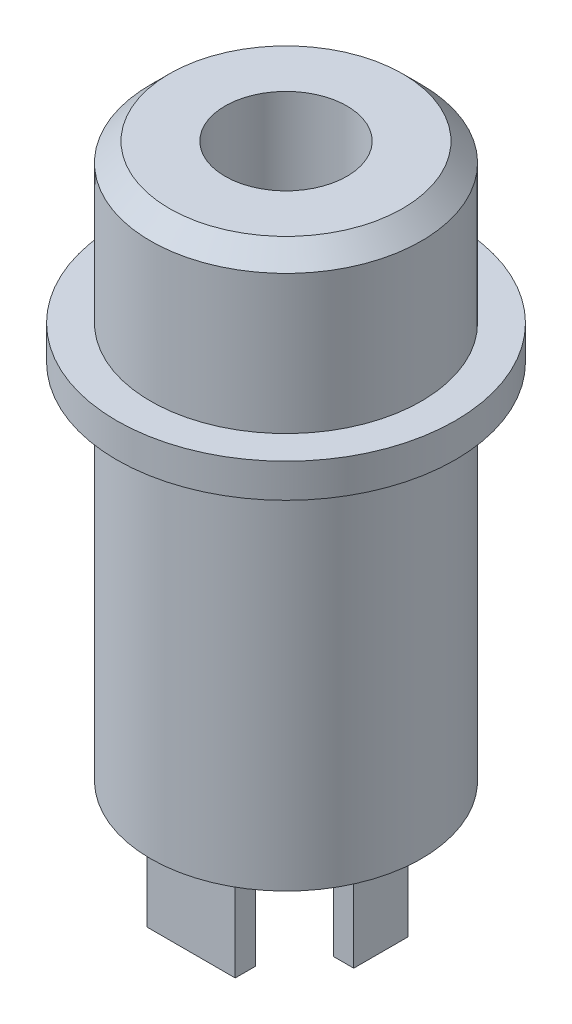
ISO-10303-21;
HEADER;
FILE_DESCRIPTION(('STEP AP214'),'2;1');
FILE_NAME('part.step','',(''),(''),'','','');
FILE_SCHEMA(('AUTOMOTIVE_DESIGN { 1 0 10303 214 1 1 1 1 }'));
ENDSEC;
DATA;
#1=APPLICATION_CONTEXT('core data for automotive mechanical design processes');
#2=APPLICATION_PROTOCOL_DEFINITION('international standard','automotive_design',2000,#1);
#3=PRODUCT_CONTEXT('',#1,'mechanical');
#4=PRODUCT('Part','Part','',(#3));
#5=PRODUCT_RELATED_PRODUCT_CATEGORY('part','',(#4));
#6=PRODUCT_DEFINITION_FORMATION('','',#4);
#7=PRODUCT_DEFINITION_CONTEXT('part definition',#1,'design');
#8=PRODUCT_DEFINITION('design','',#6,#7);
#9=PRODUCT_DEFINITION_SHAPE('','',#8);
#10=(LENGTH_UNIT() NAMED_UNIT(*) SI_UNIT(.MILLI.,.METRE.));
#11=(NAMED_UNIT(*) PLANE_ANGLE_UNIT() SI_UNIT($,.RADIAN.));
#12=(NAMED_UNIT(*) SI_UNIT($,.STERADIAN.) SOLID_ANGLE_UNIT());
#13=UNCERTAINTY_MEASURE_WITH_UNIT(LENGTH_MEASURE(1.E-05),#10,'distance_accuracy_value','');
#14=(GEOMETRIC_REPRESENTATION_CONTEXT(3) GLOBAL_UNCERTAINTY_ASSIGNED_CONTEXT((#13)) GLOBAL_UNIT_ASSIGNED_CONTEXT((#10,
#11,#12)) REPRESENTATION_CONTEXT('',''));
#15=CARTESIAN_POINT('',(0.,0.,0.));
#16=DIRECTION('',(0.,0.,1.));
#17=DIRECTION('',(1.,0.,0.));
#18=AXIS2_PLACEMENT_3D('',#15,#16,#17);
#19=CARTESIAN_POINT('',(0.,-11.7,0.));
#20=DIRECTION('',(0.,1.,0.));
#21=DIRECTION('',(0.,0.,1.));
#22=AXIS2_PLACEMENT_3D('',#19,#20,#21);
#23=PLANE('',#22);
#24=DIRECTION('',(1.,0.,0.));
#25=VECTOR('',#24,1.);
#26=CARTESIAN_POINT('',(0.,-11.7,-0.8));
#27=LINE('',#26,#25);
#28=CARTESIAN_POINT('',(-2.8,-11.7,-0.800000000000001));
#29=VERTEX_POINT('',#28);
#30=CARTESIAN_POINT('',(-2.2,-11.7,-0.8));
#31=VERTEX_POINT('',#30);
#32=EDGE_CURVE('E207',#29,#31,#27,.T.);
#33=ORIENTED_EDGE('',*,*,#32,.F.);
#34=DIRECTION('',(0.,0.,-1.));
#35=VECTOR('',#34,1.);
#36=CARTESIAN_POINT('',(-2.8,-11.7,0.));
#37=LINE('',#36,#35);
#38=CARTESIAN_POINT('',(-2.8,-11.7,0.799999999999999));
#39=VERTEX_POINT('',#38);
#40=EDGE_CURVE('E221',#39,#29,#37,.T.);
#41=ORIENTED_EDGE('',*,*,#40,.F.);
#42=DIRECTION('',(1.,0.,0.));
#43=VECTOR('',#42,1.);
#44=CARTESIAN_POINT('',(0.,-11.7,0.799999999999999));
#45=LINE('',#44,#43);
#46=CARTESIAN_POINT('',(-2.2,-11.7,0.799999999999999));
#47=VERTEX_POINT('',#46);
#48=EDGE_CURVE('E235',#39,#47,#45,.T.);
#49=ORIENTED_EDGE('',*,*,#48,.T.);
#50=DIRECTION('',(0.,0.,-1.));
#51=VECTOR('',#50,1.);
#52=CARTESIAN_POINT('',(-2.2,-11.7,0.));
#53=LINE('',#52,#51);
#54=EDGE_CURVE('E89',#47,#31,#53,.T.);
#55=ORIENTED_EDGE('',*,*,#54,.T.);
#56=EDGE_LOOP('',(#33,#41,#49,#55));
#57=FACE_BOUND('',#56,.T.);
#58=DIRECTION('',(1.,0.,0.));
#59=VECTOR('',#58,1.);
#60=CARTESIAN_POINT('',(0.,-11.7,-2.8));
#61=LINE('',#60,#59);
#62=CARTESIAN_POINT('',(-0.8,-11.7,-2.8));
#63=VERTEX_POINT('',#62);
#64=CARTESIAN_POINT('',(0.8,-11.7,-2.8));
#65=VERTEX_POINT('',#64);
#66=EDGE_CURVE('E261',#63,#65,#61,.T.);
#67=ORIENTED_EDGE('',*,*,#66,.F.);
#68=DIRECTION('',(0.,0.,1.));
#69=VECTOR('',#68,1.);
#70=CARTESIAN_POINT('',(-0.799999999999999,-11.7,0.));
#71=LINE('',#70,#69);
#72=CARTESIAN_POINT('',(-0.8,-11.7,-2.2));
#73=VERTEX_POINT('',#72);
#74=EDGE_CURVE('E255',#63,#73,#71,.T.);
#75=ORIENTED_EDGE('',*,*,#74,.T.);
#76=DIRECTION('',(1.,0.,0.));
#77=VECTOR('',#76,1.);
#78=CARTESIAN_POINT('',(0.,-11.7,-2.2));
#79=LINE('',#78,#77);
#80=CARTESIAN_POINT('',(0.8,-11.7,-2.2));
#81=VERTEX_POINT('',#80);
#82=EDGE_CURVE('E275',#73,#81,#79,.T.);
#83=ORIENTED_EDGE('',*,*,#82,.T.);
#84=DIRECTION('',(0.,0.,1.));
#85=VECTOR('',#84,1.);
#86=CARTESIAN_POINT('',(0.800000000000001,-11.7,0.));
#87=LINE('',#86,#85);
#88=EDGE_CURVE('E279',#65,#81,#87,.T.);
#89=ORIENTED_EDGE('',*,*,#88,.F.);
#90=EDGE_LOOP('',(#67,#75,#83,#89));
#91=FACE_BOUND('',#90,.T.);
#92=CARTESIAN_POINT('',(0.,-11.7,0.));
#93=DIRECTION('',(0.,1.,0.));
#94=DIRECTION('',(0.,0.,1.));
#95=AXIS2_PLACEMENT_3D('',#92,#93,#94);
#96=CIRCLE('',#95,4.);
#97=CARTESIAN_POINT('',(0.,-11.7,4.));
#98=VERTEX_POINT('',#97);
#99=EDGE_CURVE('E12',#98,#98,#96,.T.);
#100=ORIENTED_EDGE('',*,*,#99,.F.);
#101=EDGE_LOOP('',(#100));
#102=FACE_BOUND('',#101,.T.);
#103=DIRECTION('',(1.,0.,0.));
#104=VECTOR('',#103,1.);
#105=CARTESIAN_POINT('',(0.,-11.7,-0.8));
#106=LINE('',#105,#104);
#107=CARTESIAN_POINT('',(2.2,-11.7,-0.8));
#108=VERTEX_POINT('',#107);
#109=CARTESIAN_POINT('',(2.8,-11.7,-0.8));
#110=VERTEX_POINT('',#109);
#111=EDGE_CURVE('E287',#108,#110,#106,.T.);
#112=ORIENTED_EDGE('',*,*,#111,.F.);
#113=DIRECTION('',(0.,0.,-1.));
#114=VECTOR('',#113,1.);
#115=CARTESIAN_POINT('',(2.2,-11.7,0.));
#116=LINE('',#115,#114);
#117=CARTESIAN_POINT('',(2.2,-11.7,0.8));
#118=VERTEX_POINT('',#117);
#119=EDGE_CURVE('E302',#118,#108,#116,.T.);
#120=ORIENTED_EDGE('',*,*,#119,.F.);
#121=DIRECTION('',(1.,0.,0.));
#122=VECTOR('',#121,1.);
#123=CARTESIAN_POINT('',(0.,-11.7,0.8));
#124=LINE('',#123,#122);
#125=CARTESIAN_POINT('',(2.8,-11.7,0.8));
#126=VERTEX_POINT('',#125);
#127=EDGE_CURVE('E320',#118,#126,#124,.T.);
#128=ORIENTED_EDGE('',*,*,#127,.T.);
#129=DIRECTION('',(0.,0.,-1.));
#130=VECTOR('',#129,1.);
#131=CARTESIAN_POINT('',(2.8,-11.7,0.));
#132=LINE('',#131,#130);
#133=EDGE_CURVE('E317',#126,#110,#132,.T.);
#134=ORIENTED_EDGE('',*,*,#133,.T.);
#135=EDGE_LOOP('',(#112,#120,#128,#134));
#136=FACE_BOUND('',#135,.T.);
#137=DIRECTION('',(0.,0.,-1.));
#138=VECTOR('',#137,1.);
#139=CARTESIAN_POINT('',(-1.3,-11.7,0.));
#140=LINE('',#139,#138);
#141=CARTESIAN_POINT('',(-1.3,-11.7,2.8));
#142=VERTEX_POINT('',#141);
#143=CARTESIAN_POINT('',(-1.3,-11.7,2.2));
#144=VERTEX_POINT('',#143);
#145=EDGE_CURVE('E204',#142,#144,#140,.T.);
#146=ORIENTED_EDGE('',*,*,#145,.F.);
#147=DIRECTION('',(1.,0.,0.));
#148=VECTOR('',#147,1.);
#149=CARTESIAN_POINT('',(0.,-11.7,2.8));
#150=LINE('',#149,#148);
#151=CARTESIAN_POINT('',(1.3,-11.7,2.8));
#152=VERTEX_POINT('',#151);
#153=EDGE_CURVE('E200',#142,#152,#150,.T.);
#154=ORIENTED_EDGE('',*,*,#153,.T.);
#155=DIRECTION('',(0.,0.,-1.));
#156=VECTOR('',#155,1.);
#157=CARTESIAN_POINT('',(1.3,-11.7,0.));
#158=LINE('',#157,#156);
#159=CARTESIAN_POINT('',(1.3,-11.7,2.2));
#160=VERTEX_POINT('',#159);
#161=EDGE_CURVE('E81',#152,#160,#158,.T.);
#162=ORIENTED_EDGE('',*,*,#161,.T.);
#163=DIRECTION('',(1.,0.,0.));
#164=VECTOR('',#163,1.);
#165=CARTESIAN_POINT('',(0.,-11.7,2.2));
#166=LINE('',#165,#164);
#167=EDGE_CURVE('E692',#144,#160,#166,.T.);
#168=ORIENTED_EDGE('',*,*,#167,.F.);
#169=EDGE_LOOP('',(#146,#154,#162,#168));
#170=FACE_BOUND('',#169,.T.);
#171=ADVANCED_FACE('F65',(#57,#91,#102,#136,#170),#23,.F.);
#172=CARTESIAN_POINT('',(0.,-11.7,0.));
#173=DIRECTION('',(0.,1.,0.));
#174=DIRECTION('',(0.,0.,1.));
#175=AXIS2_PLACEMENT_3D('',#172,#173,#174);
#176=CYLINDRICAL_SURFACE('',#175,4.);
#177=ORIENTED_EDGE('',*,*,#99,.T.);
#178=EDGE_LOOP('',(#177));
#179=FACE_BOUND('',#178,.T.);
#180=CARTESIAN_POINT('',(0.,-1.,0.));
#181=DIRECTION('',(0.,1.,0.));
#182=DIRECTION('',(0.,0.,1.));
#183=AXIS2_PLACEMENT_3D('',#180,#181,#182);
#184=CIRCLE('',#183,4.);
#185=CARTESIAN_POINT('',(0.,-1.,4.));
#186=VERTEX_POINT('',#185);
#187=EDGE_CURVE('E362',#186,#186,#184,.T.);
#188=ORIENTED_EDGE('',*,*,#187,.F.);
#189=EDGE_LOOP('',(#188));
#190=FACE_BOUND('',#189,.T.);
#191=ADVANCED_FACE('F67',(#179,#190),#176,.T.);
#192=CARTESIAN_POINT('',(0.,-1.,0.));
#193=DIRECTION('',(0.,1.,0.));
#194=DIRECTION('',(0.,0.,1.));
#195=AXIS2_PLACEMENT_3D('',#192,#193,#194);
#196=CYLINDRICAL_SURFACE('',#195,5.);
#197=CARTESIAN_POINT('',(0.,-1.,0.));
#198=DIRECTION('',(0.,1.,0.));
#199=DIRECTION('',(0.,0.,1.));
#200=AXIS2_PLACEMENT_3D('',#197,#198,#199);
#201=CIRCLE('',#200,5.);
#202=CARTESIAN_POINT('',(0.,-1.,5.));
#203=VERTEX_POINT('',#202);
#204=EDGE_CURVE('E74',#203,#203,#201,.T.);
#205=ORIENTED_EDGE('',*,*,#204,.T.);
#206=EDGE_LOOP('',(#205));
#207=FACE_BOUND('',#206,.T.);
#208=CARTESIAN_POINT('',(0.,0.,0.));
#209=DIRECTION('',(0.,1.,0.));
#210=DIRECTION('',(0.,0.,1.));
#211=AXIS2_PLACEMENT_3D('',#208,#209,#210);
#212=CIRCLE('',#211,5.);
#213=CARTESIAN_POINT('',(0.,0.,5.));
#214=VERTEX_POINT('',#213);
#215=EDGE_CURVE('E361',#214,#214,#212,.T.);
#216=ORIENTED_EDGE('',*,*,#215,.F.);
#217=EDGE_LOOP('',(#216));
#218=FACE_BOUND('',#217,.T.);
#219=ADVANCED_FACE('F374',(#207,#218),#196,.T.);
#220=CARTESIAN_POINT('',(0.,-1.,0.));
#221=DIRECTION('',(0.,1.,0.));
#222=DIRECTION('',(0.,0.,1.));
#223=AXIS2_PLACEMENT_3D('',#220,#221,#222);
#224=PLANE('',#223);
#225=ORIENTED_EDGE('',*,*,#187,.T.);
#226=EDGE_LOOP('',(#225));
#227=FACE_BOUND('',#226,.T.);
#228=ORIENTED_EDGE('',*,*,#204,.F.);
#229=EDGE_LOOP('',(#228));
#230=FACE_BOUND('',#229,.T.);
#231=ADVANCED_FACE('F376',(#227,#230),#224,.F.);
#232=CARTESIAN_POINT('',(0.,0.,0.));
#233=DIRECTION('',(0.,1.,0.));
#234=DIRECTION('',(0.,0.,1.));
#235=AXIS2_PLACEMENT_3D('',#232,#233,#234);
#236=PLANE('',#235);
#237=CARTESIAN_POINT('',(0.,0.,0.));
#238=DIRECTION('',(0.,-1.,0.));
#239=DIRECTION('',(0.,0.,-1.));
#240=AXIS2_PLACEMENT_3D('',#237,#238,#239);
#241=CIRCLE('',#240,4.);
#242=CARTESIAN_POINT('',(0.,0.,-4.));
#243=VERTEX_POINT('',#242);
#244=EDGE_CURVE('E346',#243,#243,#241,.T.);
#245=ORIENTED_EDGE('',*,*,#244,.T.);
#246=EDGE_LOOP('',(#245));
#247=FACE_BOUND('',#246,.T.);
#248=ORIENTED_EDGE('',*,*,#215,.T.);
#249=EDGE_LOOP('',(#248));
#250=FACE_BOUND('',#249,.T.);
#251=ADVANCED_FACE('F372',(#247,#250),#236,.T.);
#252=CARTESIAN_POINT('',(3.4455,4.65,0.));
#253=DIRECTION('',(0.,1.,0.));
#254=DIRECTION('',(0.,0.,1.));
#255=AXIS2_PLACEMENT_3D('',#252,#253,#254);
#256=PLANE('',#255);
#257=CARTESIAN_POINT('',(0.,4.65,0.));
#258=DIRECTION('',(0.,1.,0.));
#259=DIRECTION('',(0.,0.,1.));
#260=AXIS2_PLACEMENT_3D('',#257,#258,#259);
#261=CIRCLE('',#260,1.8);
#262=CARTESIAN_POINT('',(0.,4.65,1.8));
#263=VERTEX_POINT('',#262);
#264=EDGE_CURVE('E341',#263,#263,#261,.T.);
#265=ORIENTED_EDGE('',*,*,#264,.F.);
#266=EDGE_LOOP('',(#265));
#267=FACE_BOUND('',#266,.T.);
#268=CARTESIAN_POINT('',(0.,4.65,0.));
#269=DIRECTION('',(0.,-1.,0.));
#270=DIRECTION('',(0.,0.,-1.));
#271=AXIS2_PLACEMENT_3D('',#268,#269,#270);
#272=CIRCLE('',#271,3.4455);
#273=CARTESIAN_POINT('',(0.,4.65,-3.4455));
#274=VERTEX_POINT('',#273);
#275=EDGE_CURVE('E357',#274,#274,#272,.T.);
#276=ORIENTED_EDGE('',*,*,#275,.F.);
#277=EDGE_LOOP('',(#276));
#278=FACE_BOUND('',#277,.T.);
#279=ADVANCED_FACE('F392',(#267,#278),#256,.T.);
#280=CARTESIAN_POINT('',(0.,4.09550000000001,0.));
#281=DIRECTION('',(0.,-1.,0.));
#282=DIRECTION('',(0.,0.,-1.));
#283=AXIS2_PLACEMENT_3D('',#280,#281,#282);
#284=CONICAL_SURFACE('',#283,4.,0.785398163397453);
#285=ORIENTED_EDGE('',*,*,#275,.T.);
#286=EDGE_LOOP('',(#285));
#287=FACE_BOUND('',#286,.T.);
#288=CARTESIAN_POINT('',(0.,4.09550000000001,0.));
#289=DIRECTION('',(0.,-1.,0.));
#290=DIRECTION('',(0.,0.,-1.));
#291=AXIS2_PLACEMENT_3D('',#288,#289,#290);
#292=CIRCLE('',#291,4.);
#293=CARTESIAN_POINT('',(0.,4.09550000000001,-4.));
#294=VERTEX_POINT('',#293);
#295=EDGE_CURVE('E353',#294,#294,#292,.T.);
#296=ORIENTED_EDGE('',*,*,#295,.F.);
#297=EDGE_LOOP('',(#296));
#298=FACE_BOUND('',#297,.T.);
#299=ADVANCED_FACE('F397',(#287,#298),#284,.T.);
#300=CARTESIAN_POINT('',(0.,0.,0.));
#301=DIRECTION('',(0.,-1.,0.));
#302=DIRECTION('',(0.,0.,-1.));
#303=AXIS2_PLACEMENT_3D('',#300,#301,#302);
#304=CYLINDRICAL_SURFACE('',#303,4.);
#305=ORIENTED_EDGE('',*,*,#295,.T.);
#306=EDGE_LOOP('',(#305));
#307=FACE_BOUND('',#306,.T.);
#308=ORIENTED_EDGE('',*,*,#244,.F.);
#309=EDGE_LOOP('',(#308));
#310=FACE_BOUND('',#309,.T.);
#311=ADVANCED_FACE('F402',(#307,#310),#304,.T.);
#312=CARTESIAN_POINT('',(0.,-10.55,0.));
#313=DIRECTION('',(0.,1.,0.));
#314=DIRECTION('',(0.,0.,1.));
#315=AXIS2_PLACEMENT_3D('',#312,#313,#314);
#316=CYLINDRICAL_SURFACE('',#315,1.8);
#317=CARTESIAN_POINT('',(0.,-10.55,0.));
#318=DIRECTION('',(0.,1.,0.));
#319=DIRECTION('',(0.,0.,1.));
#320=AXIS2_PLACEMENT_3D('',#317,#318,#319);
#321=CIRCLE('',#320,1.8);
#322=CARTESIAN_POINT('',(0.,-10.55,1.8));
#323=VERTEX_POINT('',#322);
#324=EDGE_CURVE('E342',#323,#323,#321,.T.);
#325=CARTESIAN_POINT('',(0.,-10.55,1.8));
#326=CARTESIAN_POINT('',(0.,-10.3916666666667,1.8));
#327=CARTESIAN_POINT('',(0.,-10.2333333333333,1.8));
#328=CARTESIAN_POINT('',(0.,-9.91666666666667,1.8));
#329=CARTESIAN_POINT('',(0.,-9.75833333333333,1.8));
#330=CARTESIAN_POINT('',(0.,-9.44166666666667,1.8));
#331=CARTESIAN_POINT('',(0.,-9.28333333333333,1.8));
#332=CARTESIAN_POINT('',(0.,-8.96666666666667,1.8));
#333=CARTESIAN_POINT('',(0.,-8.80833333333333,1.8));
#334=CARTESIAN_POINT('',(0.,-8.49166666666667,1.8));
#335=CARTESIAN_POINT('',(0.,-8.33333333333333,1.8));
#336=CARTESIAN_POINT('',(0.,-8.01666666666667,1.8));
#337=CARTESIAN_POINT('',(0.,-7.85833333333333,1.8));
#338=CARTESIAN_POINT('',(0.,-7.54166666666667,1.8));
#339=CARTESIAN_POINT('',(0.,-7.38333333333333,1.8));
#340=CARTESIAN_POINT('',(0.,-7.06666666666667,1.8));
#341=CARTESIAN_POINT('',(0.,-6.90833333333333,1.8));
#342=CARTESIAN_POINT('',(0.,-6.59166666666667,1.8));
#343=CARTESIAN_POINT('',(0.,-6.43333333333333,1.8));
#344=CARTESIAN_POINT('',(0.,-6.11666666666667,1.8));
#345=CARTESIAN_POINT('',(0.,-5.95833333333333,1.8));
#346=CARTESIAN_POINT('',(0.,-5.64166666666667,1.8));
#347=CARTESIAN_POINT('',(0.,-5.48333333333333,1.8));
#348=CARTESIAN_POINT('',(0.,-5.16666666666667,1.8));
#349=CARTESIAN_POINT('',(0.,-5.00833333333333,1.8));
#350=CARTESIAN_POINT('',(0.,-4.69166666666667,1.8));
#351=CARTESIAN_POINT('',(0.,-4.53333333333333,1.8));
#352=CARTESIAN_POINT('',(0.,-4.21666666666667,1.8));
#353=CARTESIAN_POINT('',(0.,-4.05833333333333,1.8));
#354=CARTESIAN_POINT('',(0.,-3.74166666666667,1.8));
#355=CARTESIAN_POINT('',(0.,-3.58333333333333,1.8));
#356=CARTESIAN_POINT('',(0.,-3.26666666666667,1.8));
#357=CARTESIAN_POINT('',(0.,-3.10833333333333,1.8));
#358=CARTESIAN_POINT('',(0.,-2.79166666666667,1.8));
#359=CARTESIAN_POINT('',(0.,-2.63333333333333,1.8));
#360=CARTESIAN_POINT('',(0.,-2.31666666666667,1.8));
#361=CARTESIAN_POINT('',(0.,-2.15833333333333,1.8));
#362=CARTESIAN_POINT('',(0.,-1.84166666666667,1.8));
#363=CARTESIAN_POINT('',(0.,-1.68333333333333,1.8));
#364=CARTESIAN_POINT('',(0.,-1.36666666666667,1.8));
#365=CARTESIAN_POINT('',(0.,-1.20833333333333,1.8));
#366=CARTESIAN_POINT('',(0.,-0.891666666666667,1.8));
#367=CARTESIAN_POINT('',(0.,-0.733333333333333,1.8));
#368=CARTESIAN_POINT('',(0.,-0.416666666666666,1.8));
#369=CARTESIAN_POINT('',(0.,-0.258333333333333,1.8));
#370=CARTESIAN_POINT('',(0.,0.0583333333333338,1.8));
#371=CARTESIAN_POINT('',(0.,0.216666666666667,1.8));
#372=CARTESIAN_POINT('',(0.,0.533333333333334,1.8));
#373=CARTESIAN_POINT('',(0.,0.691666666666667,1.8));
#374=CARTESIAN_POINT('',(0.,1.00833333333333,1.8));
#375=CARTESIAN_POINT('',(0.,1.16666666666667,1.8));
#376=CARTESIAN_POINT('',(0.,1.48333333333333,1.8));
#377=CARTESIAN_POINT('',(0.,1.64166666666667,1.8));
#378=CARTESIAN_POINT('',(0.,1.95833333333333,1.8));
#379=CARTESIAN_POINT('',(0.,2.11666666666667,1.8));
#380=CARTESIAN_POINT('',(0.,2.43333333333333,1.8));
#381=CARTESIAN_POINT('',(0.,2.59166666666667,1.8));
#382=CARTESIAN_POINT('',(0.,2.90833333333333,1.8));
#383=CARTESIAN_POINT('',(0.,3.06666666666667,1.8));
#384=CARTESIAN_POINT('',(0.,3.38333333333333,1.8));
#385=CARTESIAN_POINT('',(0.,3.54166666666667,1.8));
#386=CARTESIAN_POINT('',(0.,3.85833333333334,1.8));
#387=CARTESIAN_POINT('',(0.,4.01666666666667,1.8));
#388=CARTESIAN_POINT('',(0.,4.33333333333333,1.8));
#389=CARTESIAN_POINT('',(0.,4.49166666666667,1.8));
#390=CARTESIAN_POINT('',(0.,4.65,1.8));
#391=B_SPLINE_CURVE_WITH_KNOTS('',3,(#325,#326,#327,#328,#329,#330,#331,#332,#333,#334,#335,
#336,#337,#338,#339,#340,#341,#342,#343,#344,#345,#346,#347,#348,#349,#350,#351,#352,#353,#354,
#355,#356,#357,#358,#359,#360,#361,#362,#363,#364,#365,#366,#367,#368,#369,#370,#371,#372,#373,
#374,#375,#376,#377,#378,#379,#380,#381,#382,#383,#384,#385,#386,#387,#388,#389,#390),
.UNSPECIFIED.,.F.,.F.,(4,2,2,2,2,2,2,2,2,2,2,2,2,2,2,2,2,2,2,2,2,2,2,2,2,2,2,2,2,2,2,2,4),(0.,
0.475000000000001,0.950000000000001,1.425,1.9,2.375,2.85,3.325,3.8,4.275,4.75,5.225,5.7,6.175,
6.65,7.125,7.6,8.075,8.55,9.025,9.5,9.975,10.45,10.925,11.4,11.875,12.35,12.825,13.3,13.775,
14.25,14.725,15.2),.UNSPECIFIED.);
#392=EDGE_CURVE('BSEAM404',#323,#263,#391,.T.);
#393=ORIENTED_EDGE('',*,*,#324,.F.);
#394=ORIENTED_EDGE('',*,*,#264,.T.);
#395=ORIENTED_EDGE('',*,*,#392,.T.);
#396=ORIENTED_EDGE('',*,*,#392,.F.);
#397=EDGE_LOOP('',(#393,#395,#394,#396));
#398=FACE_BOUND('',#397,.T.);
#399=ADVANCED_FACE('F404',(#398),#316,.F.);
#400=CARTESIAN_POINT('',(0.,-10.55,0.));
#401=DIRECTION('',(0.,1.,0.));
#402=DIRECTION('',(0.,0.,1.));
#403=AXIS2_PLACEMENT_3D('',#400,#401,#402);
#404=PLANE('',#403);
#405=ORIENTED_EDGE('',*,*,#324,.T.);
#406=EDGE_LOOP('',(#405));
#407=FACE_BOUND('',#406,.T.);
#408=ADVANCED_FACE('F411',(#407),#404,.T.);
#409=CARTESIAN_POINT('',(0.,-14.7,-0.8));
#410=DIRECTION('',(0.,0.,1.));
#411=DIRECTION('',(1.,0.,0.));
#412=AXIS2_PLACEMENT_3D('',#409,#410,#411);
#413=PLANE('',#412);
#414=ORIENTED_EDGE('',*,*,#111,.T.);
#415=DIRECTION('',(0.,1.,0.));
#416=VECTOR('',#415,1.);
#417=CARTESIAN_POINT('',(2.8,-14.7,-0.8));
#418=LINE('',#417,#416);
#419=CARTESIAN_POINT('',(2.8,-14.7,-0.8));
#420=VERTEX_POINT('',#419);
#421=EDGE_CURVE('E337',#420,#110,#418,.T.);
#422=ORIENTED_EDGE('',*,*,#421,.F.);
#423=DIRECTION('',(1.,0.,0.));
#424=VECTOR('',#423,1.);
#425=CARTESIAN_POINT('',(0.,-14.7,-0.8));
#426=LINE('',#425,#424);
#427=CARTESIAN_POINT('',(2.2,-14.7,-0.8));
#428=VERTEX_POINT('',#427);
#429=EDGE_CURVE('E298',#428,#420,#426,.T.);
#430=ORIENTED_EDGE('',*,*,#429,.F.);
#431=DIRECTION('',(0.,1.,0.));
#432=VECTOR('',#431,1.);
#433=CARTESIAN_POINT('',(2.2,-14.7,-0.8));
#434=LINE('',#433,#432);
#435=EDGE_CURVE('E313',#428,#108,#434,.T.);
#436=ORIENTED_EDGE('',*,*,#435,.T.);
#437=EDGE_LOOP('',(#414,#422,#430,#436));
#438=FACE_BOUND('',#437,.T.);
#439=ADVANCED_FACE('F419',(#438),#413,.F.);
#440=CARTESIAN_POINT('',(2.8,-14.7,0.));
#441=DIRECTION('',(1.,0.,0.));
#442=DIRECTION('',(0.,0.,-1.));
#443=AXIS2_PLACEMENT_3D('',#440,#441,#442);
#444=PLANE('',#443);
#445=ORIENTED_EDGE('',*,*,#133,.F.);
#446=DIRECTION('',(0.,1.,0.));
#447=VECTOR('',#446,1.);
#448=CARTESIAN_POINT('',(2.8,-14.7,0.8));
#449=LINE('',#448,#447);
#450=CARTESIAN_POINT('',(2.8,-14.7,0.8));
#451=VERTEX_POINT('',#450);
#452=EDGE_CURVE('E333',#451,#126,#449,.T.);
#453=ORIENTED_EDGE('',*,*,#452,.F.);
#454=DIRECTION('',(0.,0.,-1.));
#455=VECTOR('',#454,1.);
#456=CARTESIAN_POINT('',(2.8,-14.7,0.));
#457=LINE('',#456,#455);
#458=EDGE_CURVE('E301',#451,#420,#457,.T.);
#459=ORIENTED_EDGE('',*,*,#458,.T.);
#460=ORIENTED_EDGE('',*,*,#421,.T.);
#461=EDGE_LOOP('',(#445,#453,#459,#460));
#462=FACE_BOUND('',#461,.T.);
#463=ADVANCED_FACE('F423',(#462),#444,.T.);
#464=CARTESIAN_POINT('',(0.,-14.7,0.8));
#465=DIRECTION('',(0.,0.,1.));
#466=DIRECTION('',(1.,0.,0.));
#467=AXIS2_PLACEMENT_3D('',#464,#465,#466);
#468=PLANE('',#467);
#469=ORIENTED_EDGE('',*,*,#127,.F.);
#470=DIRECTION('',(0.,1.,0.));
#471=VECTOR('',#470,1.);
#472=CARTESIAN_POINT('',(2.2,-14.7,0.8));
#473=LINE('',#472,#471);
#474=CARTESIAN_POINT('',(2.2,-14.7,0.8));
#475=VERTEX_POINT('',#474);
#476=EDGE_CURVE('E329',#475,#118,#473,.T.);
#477=ORIENTED_EDGE('',*,*,#476,.F.);
#478=DIRECTION('',(1.,0.,0.));
#479=VECTOR('',#478,1.);
#480=CARTESIAN_POINT('',(0.,-14.7,0.8));
#481=LINE('',#480,#479);
#482=EDGE_CURVE('E306',#475,#451,#481,.T.);
#483=ORIENTED_EDGE('',*,*,#482,.T.);
#484=ORIENTED_EDGE('',*,*,#452,.T.);
#485=EDGE_LOOP('',(#469,#477,#483,#484));
#486=FACE_BOUND('',#485,.T.);
#487=ADVANCED_FACE('F427',(#486),#468,.T.);
#488=CARTESIAN_POINT('',(2.2,-14.7,0.));
#489=DIRECTION('',(1.,0.,0.));
#490=DIRECTION('',(0.,0.,-1.));
#491=AXIS2_PLACEMENT_3D('',#488,#489,#490);
#492=PLANE('',#491);
#493=ORIENTED_EDGE('',*,*,#119,.T.);
#494=ORIENTED_EDGE('',*,*,#435,.F.);
#495=DIRECTION('',(0.,0.,-1.));
#496=VECTOR('',#495,1.);
#497=CARTESIAN_POINT('',(2.2,-14.7,0.));
#498=LINE('',#497,#496);
#499=EDGE_CURVE('E310',#475,#428,#498,.T.);
#500=ORIENTED_EDGE('',*,*,#499,.F.);
#501=ORIENTED_EDGE('',*,*,#476,.T.);
#502=EDGE_LOOP('',(#493,#494,#500,#501));
#503=FACE_BOUND('',#502,.T.);
#504=ADVANCED_FACE('F431',(#503),#492,.F.);
#505=CARTESIAN_POINT('',(0.,-14.7,0.));
#506=DIRECTION('',(0.,1.,0.));
#507=DIRECTION('',(0.,0.,1.));
#508=AXIS2_PLACEMENT_3D('',#505,#506,#507);
#509=PLANE('',#508);
#510=ORIENTED_EDGE('',*,*,#429,.T.);
#511=ORIENTED_EDGE('',*,*,#458,.F.);
#512=ORIENTED_EDGE('',*,*,#482,.F.);
#513=ORIENTED_EDGE('',*,*,#499,.T.);
#514=EDGE_LOOP('',(#510,#511,#512,#513));
#515=FACE_BOUND('',#514,.T.);
#516=ADVANCED_FACE('F435',(#515),#509,.F.);
#517=CARTESIAN_POINT('',(-0.799999999999999,-14.7,0.));
#518=DIRECTION('',(-1.,0.,0.));
#519=DIRECTION('',(0.,0.,1.));
#520=AXIS2_PLACEMENT_3D('',#517,#518,#519);
#521=PLANE('',#520);
#522=ORIENTED_EDGE('',*,*,#74,.F.);
#523=DIRECTION('',(0.,1.,0.));
#524=VECTOR('',#523,1.);
#525=CARTESIAN_POINT('',(-0.8,-14.7,-2.8));
#526=LINE('',#525,#524);
#527=CARTESIAN_POINT('',(-0.8,-14.7,-2.8));
#528=VERTEX_POINT('',#527);
#529=EDGE_CURVE('E284',#528,#63,#526,.T.);
#530=ORIENTED_EDGE('',*,*,#529,.F.);
#531=DIRECTION('',(0.,0.,1.));
#532=VECTOR('',#531,1.);
#533=CARTESIAN_POINT('',(-0.799999999999999,-14.7,0.));
#534=LINE('',#533,#532);
#535=CARTESIAN_POINT('',(-0.8,-14.7,-2.2));
#536=VERTEX_POINT('',#535);
#537=EDGE_CURVE('E256',#528,#536,#534,.T.);
#538=ORIENTED_EDGE('',*,*,#537,.T.);
#539=DIRECTION('',(0.,1.,0.));
#540=VECTOR('',#539,1.);
#541=CARTESIAN_POINT('',(-0.8,-14.7,-2.2));
#542=LINE('',#541,#540);
#543=EDGE_CURVE('E271',#536,#73,#542,.T.);
#544=ORIENTED_EDGE('',*,*,#543,.T.);
#545=EDGE_LOOP('',(#522,#530,#538,#544));
#546=FACE_BOUND('',#545,.T.);
#547=ADVANCED_FACE('F439',(#546),#521,.T.);
#548=CARTESIAN_POINT('',(0.,-14.7,-2.8));
#549=DIRECTION('',(0.,0.,1.));
#550=DIRECTION('',(1.,0.,0.));
#551=AXIS2_PLACEMENT_3D('',#548,#549,#550);
#552=PLANE('',#551);
#553=ORIENTED_EDGE('',*,*,#66,.T.);
#554=DIRECTION('',(0.,1.,0.));
#555=VECTOR('',#554,1.);
#556=CARTESIAN_POINT('',(0.8,-14.7,-2.8));
#557=LINE('',#556,#555);
#558=CARTESIAN_POINT('',(0.8,-14.7,-2.8));
#559=VERTEX_POINT('',#558);
#560=EDGE_CURVE('E288',#559,#65,#557,.T.);
#561=ORIENTED_EDGE('',*,*,#560,.F.);
#562=DIRECTION('',(1.,0.,0.));
#563=VECTOR('',#562,1.);
#564=CARTESIAN_POINT('',(0.,-14.7,-2.8));
#565=LINE('',#564,#563);
#566=EDGE_CURVE('E268',#528,#559,#565,.T.);
#567=ORIENTED_EDGE('',*,*,#566,.F.);
#568=ORIENTED_EDGE('',*,*,#529,.T.);
#569=EDGE_LOOP('',(#553,#561,#567,#568));
#570=FACE_BOUND('',#569,.T.);
#571=ADVANCED_FACE('F443',(#570),#552,.F.);
#572=CARTESIAN_POINT('',(0.800000000000001,-14.7,0.));
#573=DIRECTION('',(-1.,0.,0.));
#574=DIRECTION('',(0.,0.,1.));
#575=AXIS2_PLACEMENT_3D('',#572,#573,#574);
#576=PLANE('',#575);
#577=ORIENTED_EDGE('',*,*,#88,.T.);
#578=DIRECTION('',(0.,1.,0.));
#579=VECTOR('',#578,1.);
#580=CARTESIAN_POINT('',(0.8,-14.7,-2.2));
#581=LINE('',#580,#579);
#582=CARTESIAN_POINT('',(0.8,-14.7,-2.2));
#583=VERTEX_POINT('',#582);
#584=EDGE_CURVE('E292',#583,#81,#581,.T.);
#585=ORIENTED_EDGE('',*,*,#584,.F.);
#586=DIRECTION('',(0.,0.,1.));
#587=VECTOR('',#586,1.);
#588=CARTESIAN_POINT('',(0.800000000000001,-14.7,0.));
#589=LINE('',#588,#587);
#590=EDGE_CURVE('E265',#559,#583,#589,.T.);
#591=ORIENTED_EDGE('',*,*,#590,.F.);
#592=ORIENTED_EDGE('',*,*,#560,.T.);
#593=EDGE_LOOP('',(#577,#585,#591,#592));
#594=FACE_BOUND('',#593,.T.);
#595=ADVANCED_FACE('F449',(#594),#576,.F.);
#596=CARTESIAN_POINT('',(0.,-14.7,-2.2));
#597=DIRECTION('',(0.,0.,1.));
#598=DIRECTION('',(1.,0.,0.));
#599=AXIS2_PLACEMENT_3D('',#596,#597,#598);
#600=PLANE('',#599);
#601=ORIENTED_EDGE('',*,*,#82,.F.);
#602=ORIENTED_EDGE('',*,*,#543,.F.);
#603=DIRECTION('',(1.,0.,0.));
#604=VECTOR('',#603,1.);
#605=CARTESIAN_POINT('',(0.,-14.7,-2.2));
#606=LINE('',#605,#604);
#607=EDGE_CURVE('E260',#536,#583,#606,.T.);
#608=ORIENTED_EDGE('',*,*,#607,.T.);
#609=ORIENTED_EDGE('',*,*,#584,.T.);
#610=EDGE_LOOP('',(#601,#602,#608,#609));
#611=FACE_BOUND('',#610,.T.);
#612=ADVANCED_FACE('F445',(#611),#600,.T.);
#613=CARTESIAN_POINT('',(0.,-14.7,0.));
#614=DIRECTION('',(0.,1.,0.));
#615=DIRECTION('',(0.,0.,1.));
#616=AXIS2_PLACEMENT_3D('',#613,#614,#615);
#617=PLANE('',#616);
#618=ORIENTED_EDGE('',*,*,#537,.F.);
#619=ORIENTED_EDGE('',*,*,#566,.T.);
#620=ORIENTED_EDGE('',*,*,#590,.T.);
#621=ORIENTED_EDGE('',*,*,#607,.F.);
#622=EDGE_LOOP('',(#618,#619,#620,#621));
#623=FACE_BOUND('',#622,.T.);
#624=ADVANCED_FACE('F448',(#623),#617,.F.);
#625=CARTESIAN_POINT('',(0.,-14.7,-0.8));
#626=DIRECTION('',(0.,0.,1.));
#627=DIRECTION('',(1.,0.,0.));
#628=AXIS2_PLACEMENT_3D('',#625,#626,#627);
#629=PLANE('',#628);
#630=ORIENTED_EDGE('',*,*,#32,.T.);
#631=DIRECTION('',(0.,1.,0.));
#632=VECTOR('',#631,1.);
#633=CARTESIAN_POINT('',(-2.2,-14.7,-0.8));
#634=LINE('',#633,#632);
#635=CARTESIAN_POINT('',(-2.2,-14.7,-0.8));
#636=VERTEX_POINT('',#635);
#637=EDGE_CURVE('E252',#636,#31,#634,.T.);
#638=ORIENTED_EDGE('',*,*,#637,.F.);
#639=DIRECTION('',(1.,0.,0.));
#640=VECTOR('',#639,1.);
#641=CARTESIAN_POINT('',(0.,-14.7,-0.8));
#642=LINE('',#641,#640);
#643=CARTESIAN_POINT('',(-2.8,-14.7,-0.800000000000001));
#644=VERTEX_POINT('',#643);
#645=EDGE_CURVE('E217',#644,#636,#642,.T.);
#646=ORIENTED_EDGE('',*,*,#645,.F.);
#647=DIRECTION('',(0.,1.,0.));
#648=VECTOR('',#647,1.);
#649=CARTESIAN_POINT('',(-2.8,-14.7,-0.800000000000001));
#650=LINE('',#649,#648);
#651=EDGE_CURVE('E231',#644,#29,#650,.T.);
#652=ORIENTED_EDGE('',*,*,#651,.T.);
#653=EDGE_LOOP('',(#630,#638,#646,#652));
#654=FACE_BOUND('',#653,.T.);
#655=ADVANCED_FACE('F459',(#654),#629,.F.);
#656=CARTESIAN_POINT('',(-2.2,-14.7,0.));
#657=DIRECTION('',(1.,0.,0.));
#658=DIRECTION('',(0.,0.,-1.));
#659=AXIS2_PLACEMENT_3D('',#656,#657,#658);
#660=PLANE('',#659);
#661=ORIENTED_EDGE('',*,*,#54,.F.);
#662=DIRECTION('',(0.,1.,0.));
#663=VECTOR('',#662,1.);
#664=CARTESIAN_POINT('',(-2.2,-14.7,0.799999999999999));
#665=LINE('',#664,#663);
#666=CARTESIAN_POINT('',(-2.2,-14.7,0.799999999999999));
#667=VERTEX_POINT('',#666);
#668=EDGE_CURVE('E248',#667,#47,#665,.T.);
#669=ORIENTED_EDGE('',*,*,#668,.F.);
#670=DIRECTION('',(0.,0.,-1.));
#671=VECTOR('',#670,1.);
#672=CARTESIAN_POINT('',(-2.2,-14.7,0.));
#673=LINE('',#672,#671);
#674=EDGE_CURVE('E220',#667,#636,#673,.T.);
#675=ORIENTED_EDGE('',*,*,#674,.T.);
#676=ORIENTED_EDGE('',*,*,#637,.T.);
#677=EDGE_LOOP('',(#661,#669,#675,#676));
#678=FACE_BOUND('',#677,.T.);
#679=ADVANCED_FACE('F463',(#678),#660,.T.);
#680=CARTESIAN_POINT('',(0.,-14.7,0.799999999999999));
#681=DIRECTION('',(0.,0.,1.));
#682=DIRECTION('',(1.,0.,0.));
#683=AXIS2_PLACEMENT_3D('',#680,#681,#682);
#684=PLANE('',#683);
#685=ORIENTED_EDGE('',*,*,#48,.F.);
#686=DIRECTION('',(0.,1.,0.));
#687=VECTOR('',#686,1.);
#688=CARTESIAN_POINT('',(-2.8,-14.7,0.799999999999999));
#689=LINE('',#688,#687);
#690=CARTESIAN_POINT('',(-2.8,-14.7,0.799999999999999));
#691=VERTEX_POINT('',#690);
#692=EDGE_CURVE('E244',#691,#39,#689,.T.);
#693=ORIENTED_EDGE('',*,*,#692,.F.);
#694=DIRECTION('',(1.,0.,0.));
#695=VECTOR('',#694,1.);
#696=CARTESIAN_POINT('',(0.,-14.7,0.799999999999999));
#697=LINE('',#696,#695);
#698=EDGE_CURVE('E225',#691,#667,#697,.T.);
#699=ORIENTED_EDGE('',*,*,#698,.T.);
#700=ORIENTED_EDGE('',*,*,#668,.T.);
#701=EDGE_LOOP('',(#685,#693,#699,#700));
#702=FACE_BOUND('',#701,.T.);
#703=ADVANCED_FACE('F467',(#702),#684,.T.);
#704=CARTESIAN_POINT('',(-2.8,-14.7,0.));
#705=DIRECTION('',(1.,0.,0.));
#706=DIRECTION('',(0.,0.,-1.));
#707=AXIS2_PLACEMENT_3D('',#704,#705,#706);
#708=PLANE('',#707);
#709=ORIENTED_EDGE('',*,*,#40,.T.);
#710=ORIENTED_EDGE('',*,*,#651,.F.);
#711=DIRECTION('',(0.,0.,-1.));
#712=VECTOR('',#711,1.);
#713=CARTESIAN_POINT('',(-2.8,-14.7,0.));
#714=LINE('',#713,#712);
#715=EDGE_CURVE('E229',#691,#644,#714,.T.);
#716=ORIENTED_EDGE('',*,*,#715,.F.);
#717=ORIENTED_EDGE('',*,*,#692,.T.);
#718=EDGE_LOOP('',(#709,#710,#716,#717));
#719=FACE_BOUND('',#718,.T.);
#720=ADVANCED_FACE('F471',(#719),#708,.F.);
#721=CARTESIAN_POINT('',(0.,-14.7,0.));
#722=DIRECTION('',(0.,1.,0.));
#723=DIRECTION('',(0.,0.,1.));
#724=AXIS2_PLACEMENT_3D('',#721,#722,#723);
#725=PLANE('',#724);
#726=ORIENTED_EDGE('',*,*,#645,.T.);
#727=ORIENTED_EDGE('',*,*,#674,.F.);
#728=ORIENTED_EDGE('',*,*,#698,.F.);
#729=ORIENTED_EDGE('',*,*,#715,.T.);
#730=EDGE_LOOP('',(#726,#727,#728,#729));
#731=FACE_BOUND('',#730,.T.);
#732=ADVANCED_FACE('F475',(#731),#725,.F.);
#733=CARTESIAN_POINT('',(-1.3,-14.7,0.));
#734=DIRECTION('',(1.,0.,0.));
#735=DIRECTION('',(0.,0.,-1.));
#736=AXIS2_PLACEMENT_3D('',#733,#734,#735);
#737=PLANE('',#736);
#738=ORIENTED_EDGE('',*,*,#145,.T.);
#739=DIRECTION('',(0.,1.,0.));
#740=VECTOR('',#739,1.);
#741=CARTESIAN_POINT('',(-1.3,-14.7,2.2));
#742=LINE('',#741,#740);
#743=CARTESIAN_POINT('',(-1.3,-14.7,2.2));
#744=VERTEX_POINT('',#743);
#745=EDGE_CURVE('E183',#744,#144,#742,.T.);
#746=ORIENTED_EDGE('',*,*,#745,.F.);
#747=DIRECTION('',(0.,0.,-1.));
#748=VECTOR('',#747,1.);
#749=CARTESIAN_POINT('',(-1.3,-14.7,0.));
#750=LINE('',#749,#748);
#751=CARTESIAN_POINT('',(-1.3,-14.7,2.8));
#752=VERTEX_POINT('',#751);
#753=EDGE_CURVE('E191',#752,#744,#750,.T.);
#754=ORIENTED_EDGE('',*,*,#753,.F.);
#755=DIRECTION('',(0.,1.,0.));
#756=VECTOR('',#755,1.);
#757=CARTESIAN_POINT('',(-1.3,-14.7,2.8));
#758=LINE('',#757,#756);
#759=EDGE_CURVE('E688',#752,#142,#758,.T.);
#760=ORIENTED_EDGE('',*,*,#759,.T.);
#761=EDGE_LOOP('',(#738,#746,#754,#760));
#762=FACE_BOUND('',#761,.T.);
#763=ADVANCED_FACE('F202',(#762),#737,.F.);
#764=CARTESIAN_POINT('',(0.,-14.7,2.2));
#765=DIRECTION('',(0.,0.,1.));
#766=DIRECTION('',(1.,0.,0.));
#767=AXIS2_PLACEMENT_3D('',#764,#765,#766);
#768=PLANE('',#767);
#769=ORIENTED_EDGE('',*,*,#167,.T.);
#770=DIRECTION('',(0.,1.,0.));
#771=VECTOR('',#770,1.);
#772=CARTESIAN_POINT('',(1.3,-14.7,2.2));
#773=LINE('',#772,#771);
#774=CARTESIAN_POINT('',(1.3,-14.7,2.2));
#775=VERTEX_POINT('',#774);
#776=EDGE_CURVE('E185',#775,#160,#773,.T.);
#777=ORIENTED_EDGE('',*,*,#776,.F.);
#778=DIRECTION('',(1.,0.,0.));
#779=VECTOR('',#778,1.);
#780=CARTESIAN_POINT('',(0.,-14.7,2.2));
#781=LINE('',#780,#779);
#782=EDGE_CURVE('E178',#744,#775,#781,.T.);
#783=ORIENTED_EDGE('',*,*,#782,.F.);
#784=ORIENTED_EDGE('',*,*,#745,.T.);
#785=EDGE_LOOP('',(#769,#777,#783,#784));
#786=FACE_BOUND('',#785,.T.);
#787=ADVANCED_FACE('F181',(#786),#768,.F.);
#788=CARTESIAN_POINT('',(1.3,-14.7,0.));
#789=DIRECTION('',(1.,0.,0.));
#790=DIRECTION('',(0.,0.,-1.));
#791=AXIS2_PLACEMENT_3D('',#788,#789,#790);
#792=PLANE('',#791);
#793=ORIENTED_EDGE('',*,*,#161,.F.);
#794=DIRECTION('',(0.,1.,0.));
#795=VECTOR('',#794,1.);
#796=CARTESIAN_POINT('',(1.3,-14.7,2.8));
#797=LINE('',#796,#795);
#798=CARTESIAN_POINT('',(1.3,-14.7,2.8));
#799=VERTEX_POINT('',#798);
#800=EDGE_CURVE('E213',#799,#152,#797,.T.);
#801=ORIENTED_EDGE('',*,*,#800,.F.);
#802=DIRECTION('',(0.,0.,-1.));
#803=VECTOR('',#802,1.);
#804=CARTESIAN_POINT('',(1.3,-14.7,0.));
#805=LINE('',#804,#803);
#806=EDGE_CURVE('E190',#799,#775,#805,.T.);
#807=ORIENTED_EDGE('',*,*,#806,.T.);
#808=ORIENTED_EDGE('',*,*,#776,.T.);
#809=EDGE_LOOP('',(#793,#801,#807,#808));
#810=FACE_BOUND('',#809,.T.);
#811=ADVANCED_FACE('F484',(#810),#792,.T.);
#812=CARTESIAN_POINT('',(0.,-14.7,2.8));
#813=DIRECTION('',(0.,0.,1.));
#814=DIRECTION('',(1.,0.,0.));
#815=AXIS2_PLACEMENT_3D('',#812,#813,#814);
#816=PLANE('',#815);
#817=ORIENTED_EDGE('',*,*,#153,.F.);
#818=ORIENTED_EDGE('',*,*,#759,.F.);
#819=DIRECTION('',(1.,0.,0.));
#820=VECTOR('',#819,1.);
#821=CARTESIAN_POINT('',(0.,-14.7,2.8));
#822=LINE('',#821,#820);
#823=EDGE_CURVE('E197',#752,#799,#822,.T.);
#824=ORIENTED_EDGE('',*,*,#823,.T.);
#825=ORIENTED_EDGE('',*,*,#800,.T.);
#826=EDGE_LOOP('',(#817,#818,#824,#825));
#827=FACE_BOUND('',#826,.T.);
#828=ADVANCED_FACE('F487',(#827),#816,.T.);
#829=CARTESIAN_POINT('',(0.,-14.7,0.));
#830=DIRECTION('',(0.,-1.,0.));
#831=DIRECTION('',(0.,0.,-1.));
#832=AXIS2_PLACEMENT_3D('',#829,#830,#831);
#833=PLANE('',#832);
#834=ORIENTED_EDGE('',*,*,#753,.T.);
#835=ORIENTED_EDGE('',*,*,#782,.T.);
#836=ORIENTED_EDGE('',*,*,#806,.F.);
#837=ORIENTED_EDGE('',*,*,#823,.F.);
#838=EDGE_LOOP('',(#834,#835,#836,#837));
#839=FACE_BOUND('',#838,.T.);
#840=ADVANCED_FACE('F195',(#839),#833,.T.);
#841=CLOSED_SHELL('',(#171,#191,#219,#231,#251,#279,#299,#311,#399,#408,#439,#463,#487,#504,
#516,#547,#571,#595,#612,#624,#655,#679,#703,#720,#732,#763,#787,#811,#828,#840));
#842=MANIFOLD_SOLID_BREP('B2',#841);
#843=ADVANCED_BREP_SHAPE_REPRESENTATION('',(#18,#842),#14);
#844=SHAPE_DEFINITION_REPRESENTATION(#9,#843);
ENDSEC;
END-ISO-10303-21;
